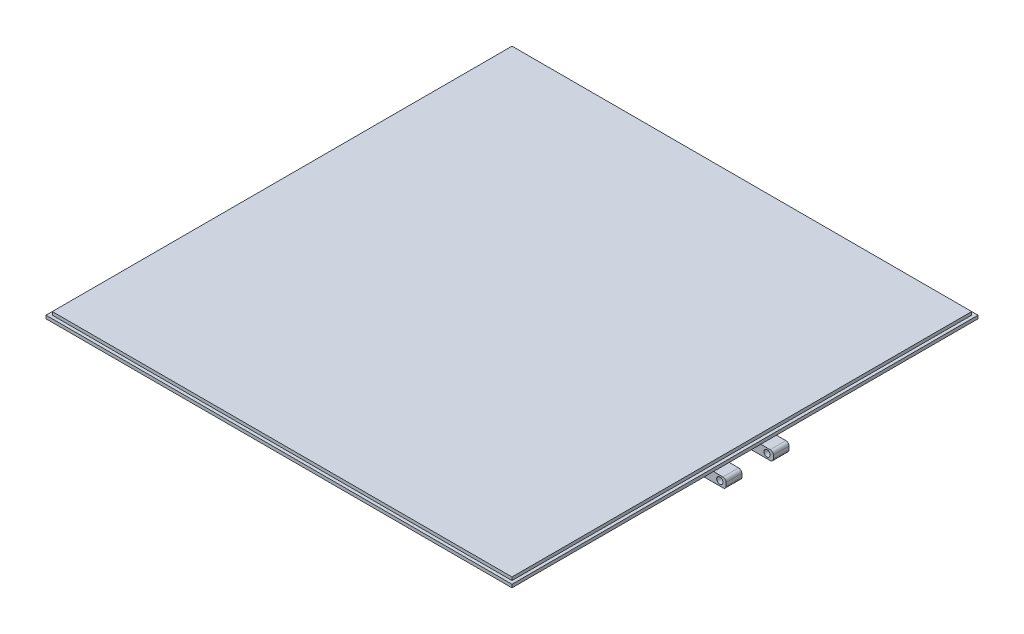
ISO-10303-21;
HEADER;
FILE_DESCRIPTION(('STEP AP214'),'2;1');
FILE_NAME('part.step','',(''),(''),'','','');
FILE_SCHEMA(('AUTOMOTIVE_DESIGN { 1 0 10303 214 1 1 1 1 }'));
ENDSEC;
DATA;
#1=APPLICATION_CONTEXT('core data for automotive mechanical design processes');
#2=APPLICATION_PROTOCOL_DEFINITION('international standard','automotive_design',2000,#1);
#3=PRODUCT_CONTEXT('',#1,'mechanical');
#4=PRODUCT('Part','Part','',(#3));
#5=PRODUCT_RELATED_PRODUCT_CATEGORY('part','',(#4));
#6=PRODUCT_DEFINITION_FORMATION('','',#4);
#7=PRODUCT_DEFINITION_CONTEXT('part definition',#1,'design');
#8=PRODUCT_DEFINITION('design','',#6,#7);
#9=PRODUCT_DEFINITION_SHAPE('','',#8);
#10=(LENGTH_UNIT() NAMED_UNIT(*) SI_UNIT(.MILLI.,.METRE.));
#11=(NAMED_UNIT(*) PLANE_ANGLE_UNIT() SI_UNIT($,.RADIAN.));
#12=(NAMED_UNIT(*) SI_UNIT($,.STERADIAN.) SOLID_ANGLE_UNIT());
#13=UNCERTAINTY_MEASURE_WITH_UNIT(LENGTH_MEASURE(1.E-05),#10,'distance_accuracy_value','');
#14=(GEOMETRIC_REPRESENTATION_CONTEXT(3) GLOBAL_UNCERTAINTY_ASSIGNED_CONTEXT((#13)) GLOBAL_UNIT_ASSIGNED_CONTEXT((#10,
#11,#12)) REPRESENTATION_CONTEXT('',''));
#15=CARTESIAN_POINT('',(0.,0.,0.));
#16=DIRECTION('',(0.,0.,1.));
#17=DIRECTION('',(1.,0.,0.));
#18=AXIS2_PLACEMENT_3D('',#15,#16,#17);
#19=CARTESIAN_POINT('',(0.,26.,0.));
#20=DIRECTION('',(0.,-1.,0.));
#21=DIRECTION('',(0.,0.,-1.));
#22=AXIS2_PLACEMENT_3D('',#19,#20,#21);
#23=PLANE('',#22);
#24=DIRECTION('',(0.,0.,-1.));
#25=VECTOR('',#24,1.);
#26=CARTESIAN_POINT('',(-74.,26.,74.));
#27=LINE('',#26,#25);
#28=CARTESIAN_POINT('',(-74.,26.,74.));
#29=VERTEX_POINT('',#28);
#30=CARTESIAN_POINT('',(-74.,26.,-74.));
#31=VERTEX_POINT('',#30);
#32=EDGE_CURVE('E267',#29,#31,#27,.T.);
#33=ORIENTED_EDGE('',*,*,#32,.F.);
#34=DIRECTION('',(-1.,0.,0.));
#35=VECTOR('',#34,1.);
#36=CARTESIAN_POINT('',(-74.,26.,74.));
#37=LINE('',#36,#35);
#38=CARTESIAN_POINT('',(74.,26.,74.));
#39=VERTEX_POINT('',#38);
#40=EDGE_CURVE('E277',#39,#29,#37,.T.);
#41=ORIENTED_EDGE('',*,*,#40,.F.);
#42=DIRECTION('',(0.,0.,1.));
#43=VECTOR('',#42,1.);
#44=CARTESIAN_POINT('',(74.,26.,74.));
#45=LINE('',#44,#43);
#46=CARTESIAN_POINT('',(74.,26.,-74.));
#47=VERTEX_POINT('',#46);
#48=EDGE_CURVE('E274',#47,#39,#45,.T.);
#49=ORIENTED_EDGE('',*,*,#48,.F.);
#50=DIRECTION('',(1.,0.,0.));
#51=VECTOR('',#50,1.);
#52=CARTESIAN_POINT('',(-74.,26.,-74.));
#53=LINE('',#52,#51);
#54=EDGE_CURVE('E270',#31,#47,#53,.T.);
#55=ORIENTED_EDGE('',*,*,#54,.F.);
#56=EDGE_LOOP('',(#33,#41,#49,#55));
#57=FACE_BOUND('',#56,.T.);
#58=DIRECTION('',(-1.,0.,0.));
#59=VECTOR('',#58,1.);
#60=CARTESIAN_POINT('',(73.,26.,73.));
#61=LINE('',#60,#59);
#62=CARTESIAN_POINT('',(73.,26.,73.));
#63=VERTEX_POINT('',#62);
#64=CARTESIAN_POINT('',(-73.,26.,73.));
#65=VERTEX_POINT('',#64);
#66=EDGE_CURVE('E306',#63,#65,#61,.T.);
#67=ORIENTED_EDGE('',*,*,#66,.T.);
#68=DIRECTION('',(0.,0.,-1.));
#69=VECTOR('',#68,1.);
#70=CARTESIAN_POINT('',(-73.,26.,73.));
#71=LINE('',#70,#69);
#72=CARTESIAN_POINT('',(-73.,26.,-73.));
#73=VERTEX_POINT('',#72);
#74=EDGE_CURVE('E309',#65,#73,#71,.T.);
#75=ORIENTED_EDGE('',*,*,#74,.T.);
#76=DIRECTION('',(1.,0.,0.));
#77=VECTOR('',#76,1.);
#78=CARTESIAN_POINT('',(73.,26.,-73.));
#79=LINE('',#78,#77);
#80=CARTESIAN_POINT('',(73.,26.,-73.));
#81=VERTEX_POINT('',#80);
#82=EDGE_CURVE('E332',#73,#81,#79,.T.);
#83=ORIENTED_EDGE('',*,*,#82,.T.);
#84=DIRECTION('',(0.,0.,1.));
#85=VECTOR('',#84,1.);
#86=CARTESIAN_POINT('',(73.,26.,73.));
#87=LINE('',#86,#85);
#88=EDGE_CURVE('E297',#81,#63,#87,.T.);
#89=ORIENTED_EDGE('',*,*,#88,.T.);
#90=EDGE_LOOP('',(#67,#75,#83,#89));
#91=FACE_BOUND('',#90,.T.);
#92=ADVANCED_FACE('F55',(#57,#91),#23,.F.);
#93=CARTESIAN_POINT('',(-74.,26.,74.));
#94=DIRECTION('',(-1.,0.,0.));
#95=DIRECTION('',(0.,0.,1.));
#96=AXIS2_PLACEMENT_3D('',#93,#94,#95);
#97=PLANE('',#96);
#98=DIRECTION('',(0.,0.,-1.));
#99=VECTOR('',#98,1.);
#100=CARTESIAN_POINT('',(-74.,25.,74.));
#101=LINE('',#100,#99);
#102=CARTESIAN_POINT('',(-74.,25.,74.));
#103=VERTEX_POINT('',#102);
#104=CARTESIAN_POINT('',(-74.,25.,-74.));
#105=VERTEX_POINT('',#104);
#106=EDGE_CURVE('E266',#103,#105,#101,.T.);
#107=ORIENTED_EDGE('',*,*,#106,.F.);
#108=DIRECTION('',(0.,-1.,0.));
#109=VECTOR('',#108,1.);
#110=CARTESIAN_POINT('',(-74.,26.,74.));
#111=LINE('',#110,#109);
#112=EDGE_CURVE('E295',#29,#103,#111,.T.);
#113=ORIENTED_EDGE('',*,*,#112,.F.);
#114=ORIENTED_EDGE('',*,*,#32,.T.);
#115=DIRECTION('',(0.,-1.,0.));
#116=VECTOR('',#115,1.);
#117=CARTESIAN_POINT('',(-74.,26.,-74.));
#118=LINE('',#117,#116);
#119=EDGE_CURVE('E280',#31,#105,#118,.T.);
#120=ORIENTED_EDGE('',*,*,#119,.T.);
#121=EDGE_LOOP('',(#107,#113,#114,#120));
#122=FACE_BOUND('',#121,.T.);
#123=ADVANCED_FACE('F452',(#122),#97,.T.);
#124=CARTESIAN_POINT('',(-74.,26.,74.));
#125=DIRECTION('',(0.,0.,1.));
#126=DIRECTION('',(1.,0.,0.));
#127=AXIS2_PLACEMENT_3D('',#124,#125,#126);
#128=PLANE('',#127);
#129=DIRECTION('',(-1.,0.,0.));
#130=VECTOR('',#129,1.);
#131=CARTESIAN_POINT('',(-74.,25.,74.));
#132=LINE('',#131,#130);
#133=CARTESIAN_POINT('',(74.,25.,74.));
#134=VERTEX_POINT('',#133);
#135=EDGE_CURVE('E271',#134,#103,#132,.T.);
#136=ORIENTED_EDGE('',*,*,#135,.F.);
#137=DIRECTION('',(0.,-1.,0.));
#138=VECTOR('',#137,1.);
#139=CARTESIAN_POINT('',(74.,26.,74.));
#140=LINE('',#139,#138);
#141=EDGE_CURVE('E298',#39,#134,#140,.T.);
#142=ORIENTED_EDGE('',*,*,#141,.F.);
#143=ORIENTED_EDGE('',*,*,#40,.T.);
#144=ORIENTED_EDGE('',*,*,#112,.T.);
#145=EDGE_LOOP('',(#136,#142,#143,#144));
#146=FACE_BOUND('',#145,.T.);
#147=ADVANCED_FACE('F458',(#146),#128,.T.);
#148=CARTESIAN_POINT('',(74.,26.,74.));
#149=DIRECTION('',(1.,0.,0.));
#150=DIRECTION('',(0.,0.,-1.));
#151=AXIS2_PLACEMENT_3D('',#148,#149,#150);
#152=PLANE('',#151);
#153=DIRECTION('',(0.,0.,1.));
#154=VECTOR('',#153,1.);
#155=CARTESIAN_POINT('',(74.,25.,74.));
#156=LINE('',#155,#154);
#157=CARTESIAN_POINT('',(74.,25.,-74.));
#158=VERTEX_POINT('',#157);
#159=CARTESIAN_POINT('',(74.,25.,-9.99999999999999));
#160=VERTEX_POINT('',#159);
#161=EDGE_CURVE('E287',#158,#160,#156,.T.);
#162=ORIENTED_EDGE('',*,*,#161,.F.);
#163=DIRECTION('',(0.,-1.,0.));
#164=VECTOR('',#163,1.);
#165=CARTESIAN_POINT('',(74.,26.,-74.));
#166=LINE('',#165,#164);
#167=EDGE_CURVE('E301',#47,#158,#166,.T.);
#168=ORIENTED_EDGE('',*,*,#167,.F.);
#169=ORIENTED_EDGE('',*,*,#48,.T.);
#170=ORIENTED_EDGE('',*,*,#141,.T.);
#171=CARTESIAN_POINT('',(74.,25.,10.));
#172=VERTEX_POINT('',#171);
#173=EDGE_CURVE('E286',#172,#134,#156,.T.);
#174=ORIENTED_EDGE('',*,*,#173,.F.);
#175=CARTESIAN_POINT('',(74.,25.,5.));
#176=VERTEX_POINT('',#175);
#177=EDGE_CURVE('E292',#176,#172,#156,.T.);
#178=ORIENTED_EDGE('',*,*,#177,.F.);
#179=CARTESIAN_POINT('',(74.,25.,-5.));
#180=VERTEX_POINT('',#179);
#181=EDGE_CURVE('E291',#180,#176,#156,.T.);
#182=ORIENTED_EDGE('',*,*,#181,.F.);
#183=EDGE_CURVE('E290',#160,#180,#156,.T.);
#184=ORIENTED_EDGE('',*,*,#183,.F.);
#185=EDGE_LOOP('',(#162,#168,#169,#170,#174,#178,#182,#184));
#186=FACE_BOUND('',#185,.T.);
#187=ADVANCED_FACE('F407',(#186),#152,.T.);
#188=CARTESIAN_POINT('',(-74.,26.,-74.));
#189=DIRECTION('',(0.,0.,-1.));
#190=DIRECTION('',(-1.,0.,0.));
#191=AXIS2_PLACEMENT_3D('',#188,#189,#190);
#192=PLANE('',#191);
#193=DIRECTION('',(1.,0.,0.));
#194=VECTOR('',#193,1.);
#195=CARTESIAN_POINT('',(-74.,25.,-74.));
#196=LINE('',#195,#194);
#197=EDGE_CURVE('E283',#105,#158,#196,.T.);
#198=ORIENTED_EDGE('',*,*,#197,.F.);
#199=ORIENTED_EDGE('',*,*,#119,.F.);
#200=ORIENTED_EDGE('',*,*,#54,.T.);
#201=ORIENTED_EDGE('',*,*,#167,.T.);
#202=EDGE_LOOP('',(#198,#199,#200,#201));
#203=FACE_BOUND('',#202,.T.);
#204=ADVANCED_FACE('F471',(#203),#192,.T.);
#205=CARTESIAN_POINT('',(0.,27.,0.));
#206=DIRECTION('',(0.,1.,0.));
#207=DIRECTION('',(0.,0.,1.));
#208=AXIS2_PLACEMENT_3D('',#205,#206,#207);
#209=PLANE('',#208);
#210=DIRECTION('',(0.,0.,1.));
#211=VECTOR('',#210,1.);
#212=CARTESIAN_POINT('',(-73.,27.,73.));
#213=LINE('',#212,#211);
#214=CARTESIAN_POINT('',(-73.,27.,-73.));
#215=VERTEX_POINT('',#214);
#216=CARTESIAN_POINT('',(-73.,27.,73.));
#217=VERTEX_POINT('',#216);
#218=EDGE_CURVE('E312',#215,#217,#213,.T.);
#219=ORIENTED_EDGE('',*,*,#218,.T.);
#220=DIRECTION('',(1.,0.,0.));
#221=VECTOR('',#220,1.);
#222=CARTESIAN_POINT('',(73.,27.,73.));
#223=LINE('',#222,#221);
#224=CARTESIAN_POINT('',(73.,27.,73.));
#225=VERTEX_POINT('',#224);
#226=EDGE_CURVE('E315',#217,#225,#223,.T.);
#227=ORIENTED_EDGE('',*,*,#226,.T.);
#228=DIRECTION('',(0.,0.,-1.));
#229=VECTOR('',#228,1.);
#230=CARTESIAN_POINT('',(73.,27.,73.));
#231=LINE('',#230,#229);
#232=CARTESIAN_POINT('',(73.,27.,-73.));
#233=VERTEX_POINT('',#232);
#234=EDGE_CURVE('E317',#225,#233,#231,.T.);
#235=ORIENTED_EDGE('',*,*,#234,.T.);
#236=DIRECTION('',(-1.,0.,0.));
#237=VECTOR('',#236,1.);
#238=CARTESIAN_POINT('',(73.,27.,-73.));
#239=LINE('',#238,#237);
#240=EDGE_CURVE('E319',#233,#215,#239,.T.);
#241=ORIENTED_EDGE('',*,*,#240,.T.);
#242=EDGE_LOOP('',(#219,#227,#235,#241));
#243=FACE_BOUND('',#242,.T.);
#244=ADVANCED_FACE('F473',(#243),#209,.T.);
#245=CARTESIAN_POINT('',(73.,27.,-73.));
#246=DIRECTION('',(0.,0.,1.));
#247=DIRECTION('',(1.,0.,0.));
#248=AXIS2_PLACEMENT_3D('',#245,#246,#247);
#249=PLANE('',#248);
#250=ORIENTED_EDGE('',*,*,#82,.F.);
#251=DIRECTION('',(0.,-1.,0.));
#252=VECTOR('',#251,1.);
#253=CARTESIAN_POINT('',(-73.,27.,-73.));
#254=LINE('',#253,#252);
#255=EDGE_CURVE('E321',#215,#73,#254,.T.);
#256=ORIENTED_EDGE('',*,*,#255,.F.);
#257=ORIENTED_EDGE('',*,*,#240,.F.);
#258=DIRECTION('',(0.,-1.,0.));
#259=VECTOR('',#258,1.);
#260=CARTESIAN_POINT('',(73.,27.,-73.));
#261=LINE('',#260,#259);
#262=EDGE_CURVE('E324',#233,#81,#261,.T.);
#263=ORIENTED_EDGE('',*,*,#262,.T.);
#264=EDGE_LOOP('',(#250,#256,#257,#263));
#265=FACE_BOUND('',#264,.T.);
#266=ADVANCED_FACE('F478',(#265),#249,.F.);
#267=CARTESIAN_POINT('',(73.,27.,73.));
#268=DIRECTION('',(-1.,0.,0.));
#269=DIRECTION('',(0.,0.,1.));
#270=AXIS2_PLACEMENT_3D('',#267,#268,#269);
#271=PLANE('',#270);
#272=ORIENTED_EDGE('',*,*,#88,.F.);
#273=ORIENTED_EDGE('',*,*,#262,.F.);
#274=ORIENTED_EDGE('',*,*,#234,.F.);
#275=DIRECTION('',(0.,-1.,0.));
#276=VECTOR('',#275,1.);
#277=CARTESIAN_POINT('',(73.,27.,73.));
#278=LINE('',#277,#276);
#279=EDGE_CURVE('E326',#225,#63,#278,.T.);
#280=ORIENTED_EDGE('',*,*,#279,.T.);
#281=EDGE_LOOP('',(#272,#273,#274,#280));
#282=FACE_BOUND('',#281,.T.);
#283=ADVANCED_FACE('F484',(#282),#271,.F.);
#284=CARTESIAN_POINT('',(73.,27.,73.));
#285=DIRECTION('',(0.,0.,-1.));
#286=DIRECTION('',(-1.,0.,0.));
#287=AXIS2_PLACEMENT_3D('',#284,#285,#286);
#288=PLANE('',#287);
#289=ORIENTED_EDGE('',*,*,#66,.F.);
#290=ORIENTED_EDGE('',*,*,#279,.F.);
#291=ORIENTED_EDGE('',*,*,#226,.F.);
#292=DIRECTION('',(0.,-1.,0.));
#293=VECTOR('',#292,1.);
#294=CARTESIAN_POINT('',(-73.,27.,73.));
#295=LINE('',#294,#293);
#296=EDGE_CURVE('E329',#217,#65,#295,.T.);
#297=ORIENTED_EDGE('',*,*,#296,.T.);
#298=EDGE_LOOP('',(#289,#290,#291,#297));
#299=FACE_BOUND('',#298,.T.);
#300=ADVANCED_FACE('F488',(#299),#288,.F.);
#301=CARTESIAN_POINT('',(-73.,27.,73.));
#302=DIRECTION('',(1.,0.,0.));
#303=DIRECTION('',(0.,0.,-1.));
#304=AXIS2_PLACEMENT_3D('',#301,#302,#303);
#305=PLANE('',#304);
#306=ORIENTED_EDGE('',*,*,#74,.F.);
#307=ORIENTED_EDGE('',*,*,#296,.F.);
#308=ORIENTED_EDGE('',*,*,#218,.F.);
#309=ORIENTED_EDGE('',*,*,#255,.T.);
#310=EDGE_LOOP('',(#306,#307,#308,#309));
#311=FACE_BOUND('',#310,.T.);
#312=ADVANCED_FACE('F492',(#311),#305,.F.);
#313=CARTESIAN_POINT('',(0.,0.,10.));
#314=DIRECTION('',(0.,0.,1.));
#315=DIRECTION('',(1.,0.,0.));
#316=AXIS2_PLACEMENT_3D('',#313,#314,#315);
#317=PLANE('',#316);
#318=DIRECTION('',(1.,0.,0.));
#319=VECTOR('',#318,1.);
#320=CARTESIAN_POINT('',(68.,22.,10.));
#321=LINE('',#320,#319);
#322=CARTESIAN_POINT('',(68.,22.,10.));
#323=VERTEX_POINT('',#322);
#324=CARTESIAN_POINT('',(77.,22.,10.));
#325=VERTEX_POINT('',#324);
#326=EDGE_CURVE('E249',#323,#325,#321,.T.);
#327=ORIENTED_EDGE('',*,*,#326,.T.);
#328=CARTESIAN_POINT('',(77.,23.,10.));
#329=DIRECTION('',(0.,0.,1.));
#330=DIRECTION('',(1.,0.,0.));
#331=AXIS2_PLACEMENT_3D('',#328,#329,#330);
#332=CIRCLE('',#331,1.);
#333=CARTESIAN_POINT('',(78.,23.,10.));
#334=VERTEX_POINT('',#333);
#335=EDGE_CURVE('E63',#325,#334,#332,.T.);
#336=ORIENTED_EDGE('',*,*,#335,.T.);
#337=DIRECTION('',(0.,1.,0.));
#338=VECTOR('',#337,1.);
#339=CARTESIAN_POINT('',(78.,25.,10.));
#340=LINE('',#339,#338);
#341=CARTESIAN_POINT('',(78.,24.,10.));
#342=VERTEX_POINT('',#341);
#343=EDGE_CURVE('E251',#334,#342,#340,.T.);
#344=ORIENTED_EDGE('',*,*,#343,.T.);
#345=CARTESIAN_POINT('',(77.,24.,10.));
#346=DIRECTION('',(0.,0.,1.));
#347=DIRECTION('',(1.,0.,0.));
#348=AXIS2_PLACEMENT_3D('',#345,#346,#347);
#349=CIRCLE('',#348,1.);
#350=CARTESIAN_POINT('',(77.,25.,10.));
#351=VERTEX_POINT('',#350);
#352=EDGE_CURVE('E70',#342,#351,#349,.T.);
#353=ORIENTED_EDGE('',*,*,#352,.T.);
#354=DIRECTION('',(-1.,0.,0.));
#355=VECTOR('',#354,1.);
#356=CARTESIAN_POINT('',(68.,25.,10.));
#357=LINE('',#356,#355);
#358=EDGE_CURVE('E255',#351,#172,#357,.T.);
#359=ORIENTED_EDGE('',*,*,#358,.T.);
#360=CARTESIAN_POINT('',(65.,25.,10.));
#361=VERTEX_POINT('',#360);
#362=EDGE_CURVE('E254',#172,#361,#357,.T.);
#363=ORIENTED_EDGE('',*,*,#362,.T.);
#364=DIRECTION('',(-0.707106781186544,0.707106781186551,0.));
#365=VECTOR('',#364,1.);
#366=CARTESIAN_POINT('',(68.,22.,10.));
#367=LINE('',#366,#365);
#368=EDGE_CURVE('E343',#361,#323,#367,.F.);
#369=ORIENTED_EDGE('',*,*,#368,.T.);
#370=EDGE_LOOP('',(#327,#336,#344,#353,#359,#363,#369));
#371=FACE_BOUND('',#370,.T.);
#372=CARTESIAN_POINT('',(76.,23.5,10.));
#373=DIRECTION('',(0.,0.,1.));
#374=DIRECTION('',(1.,0.,0.));
#375=AXIS2_PLACEMENT_3D('',#372,#373,#374);
#376=CIRCLE('',#375,0.999999999999998);
#377=CARTESIAN_POINT('',(77.,23.5,10.));
#378=VERTEX_POINT('',#377);
#379=EDGE_CURVE('E240',#378,#378,#376,.T.);
#380=ORIENTED_EDGE('',*,*,#379,.F.);
#381=EDGE_LOOP('',(#380));
#382=FACE_BOUND('',#381,.T.);
#383=ADVANCED_FACE('F374',(#371,#382),#317,.T.);
#384=CARTESIAN_POINT('',(0.,0.,5.));
#385=DIRECTION('',(0.,0.,1.));
#386=DIRECTION('',(1.,0.,0.));
#387=AXIS2_PLACEMENT_3D('',#384,#385,#386);
#388=PLANE('',#387);
#389=DIRECTION('',(0.,1.,0.));
#390=VECTOR('',#389,1.);
#391=CARTESIAN_POINT('',(78.,25.,5.));
#392=LINE('',#391,#390);
#393=CARTESIAN_POINT('',(78.,23.,5.));
#394=VERTEX_POINT('',#393);
#395=CARTESIAN_POINT('',(78.,24.,5.));
#396=VERTEX_POINT('',#395);
#397=EDGE_CURVE('E259',#394,#396,#392,.T.);
#398=ORIENTED_EDGE('',*,*,#397,.F.);
#399=CARTESIAN_POINT('',(77.,23.,5.));
#400=DIRECTION('',(0.,0.,1.));
#401=DIRECTION('',(1.,0.,0.));
#402=AXIS2_PLACEMENT_3D('',#399,#400,#401);
#403=CIRCLE('',#402,1.);
#404=CARTESIAN_POINT('',(77.,22.,5.));
#405=VERTEX_POINT('',#404);
#406=EDGE_CURVE('E369',#394,#405,#403,.F.);
#407=ORIENTED_EDGE('',*,*,#406,.T.);
#408=DIRECTION('',(1.,0.,0.));
#409=VECTOR('',#408,1.);
#410=CARTESIAN_POINT('',(68.,22.,5.));
#411=LINE('',#410,#409);
#412=CARTESIAN_POINT('',(68.,22.,5.));
#413=VERTEX_POINT('',#412);
#414=EDGE_CURVE('E247',#413,#405,#411,.T.);
#415=ORIENTED_EDGE('',*,*,#414,.F.);
#416=DIRECTION('',(0.707106781186544,-0.707106781186551,0.));
#417=VECTOR('',#416,1.);
#418=CARTESIAN_POINT('',(45.0000000000003,44.9999999999999,5.));
#419=LINE('',#418,#417);
#420=CARTESIAN_POINT('',(65.,25.,5.));
#421=VERTEX_POINT('',#420);
#422=EDGE_CURVE('E220',#413,#421,#419,.F.);
#423=ORIENTED_EDGE('',*,*,#422,.T.);
#424=DIRECTION('',(-1.,0.,0.));
#425=VECTOR('',#424,1.);
#426=CARTESIAN_POINT('',(68.,25.,5.));
#427=LINE('',#426,#425);
#428=EDGE_CURVE('E262',#176,#421,#427,.T.);
#429=ORIENTED_EDGE('',*,*,#428,.F.);
#430=CARTESIAN_POINT('',(77.,25.,5.));
#431=VERTEX_POINT('',#430);
#432=EDGE_CURVE('E252',#431,#176,#427,.T.);
#433=ORIENTED_EDGE('',*,*,#432,.F.);
#434=CARTESIAN_POINT('',(77.,24.,5.));
#435=DIRECTION('',(0.,0.,1.));
#436=DIRECTION('',(1.,0.,0.));
#437=AXIS2_PLACEMENT_3D('',#434,#435,#436);
#438=CIRCLE('',#437,1.);
#439=EDGE_CURVE('E367',#431,#396,#438,.F.);
#440=ORIENTED_EDGE('',*,*,#439,.T.);
#441=EDGE_LOOP('',(#398,#407,#415,#423,#429,#433,#440));
#442=FACE_BOUND('',#441,.T.);
#443=CARTESIAN_POINT('',(76.,23.5,5.));
#444=DIRECTION('',(0.,0.,1.));
#445=DIRECTION('',(1.,0.,0.));
#446=AXIS2_PLACEMENT_3D('',#443,#444,#445);
#447=CIRCLE('',#446,0.999999999999998);
#448=CARTESIAN_POINT('',(77.,23.5,5.));
#449=VERTEX_POINT('',#448);
#450=EDGE_CURVE('E236',#449,#449,#447,.T.);
#451=ORIENTED_EDGE('',*,*,#450,.T.);
#452=EDGE_LOOP('',(#451));
#453=FACE_BOUND('',#452,.T.);
#454=ADVANCED_FACE('F385',(#442,#453),#388,.F.);
#455=CARTESIAN_POINT('',(68.,22.,10.));
#456=DIRECTION('',(0.,1.,0.));
#457=DIRECTION('',(-1.,0.,0.));
#458=AXIS2_PLACEMENT_3D('',#455,#456,#457);
#459=PLANE('',#458);
#460=ORIENTED_EDGE('',*,*,#414,.T.);
#461=DIRECTION('',(0.,0.,-1.));
#462=VECTOR('',#461,1.);
#463=CARTESIAN_POINT('',(77.,22.,10.));
#464=LINE('',#463,#462);
#465=EDGE_CURVE('E78',#405,#325,#464,.F.);
#466=ORIENTED_EDGE('',*,*,#465,.T.);
#467=ORIENTED_EDGE('',*,*,#326,.F.);
#468=DIRECTION('',(0.,0.,-1.));
#469=VECTOR('',#468,1.);
#470=CARTESIAN_POINT('',(68.,22.,10.));
#471=LINE('',#470,#469);
#472=EDGE_CURVE('E257',#323,#413,#471,.T.);
#473=ORIENTED_EDGE('',*,*,#472,.T.);
#474=EDGE_LOOP('',(#460,#466,#467,#473));
#475=FACE_BOUND('',#474,.T.);
#476=ADVANCED_FACE('F387',(#475),#459,.F.);
#477=CARTESIAN_POINT('',(78.,25.,10.));
#478=DIRECTION('',(-1.,0.,0.));
#479=DIRECTION('',(0.,-1.,0.));
#480=AXIS2_PLACEMENT_3D('',#477,#478,#479);
#481=PLANE('',#480);
#482=ORIENTED_EDGE('',*,*,#343,.F.);
#483=DIRECTION('',(0.,0.,-1.));
#484=VECTOR('',#483,1.);
#485=CARTESIAN_POINT('',(78.,23.,10.));
#486=LINE('',#485,#484);
#487=EDGE_CURVE('E364',#334,#394,#486,.T.);
#488=ORIENTED_EDGE('',*,*,#487,.T.);
#489=ORIENTED_EDGE('',*,*,#397,.T.);
#490=DIRECTION('',(0.,0.,-1.));
#491=VECTOR('',#490,1.);
#492=CARTESIAN_POINT('',(78.,24.,10.));
#493=LINE('',#492,#491);
#494=EDGE_CURVE('E362',#396,#342,#493,.F.);
#495=ORIENTED_EDGE('',*,*,#494,.T.);
#496=EDGE_LOOP('',(#482,#488,#489,#495));
#497=FACE_BOUND('',#496,.T.);
#498=ADVANCED_FACE('F379',(#497),#481,.F.);
#499=CARTESIAN_POINT('',(68.,25.,10.));
#500=DIRECTION('',(0.,-1.,0.));
#501=DIRECTION('',(0.,0.,-1.));
#502=AXIS2_PLACEMENT_3D('',#499,#500,#501);
#503=PLANE('',#502);
#504=ORIENTED_EDGE('',*,*,#358,.F.);
#505=DIRECTION('',(0.,0.,-1.));
#506=VECTOR('',#505,1.);
#507=CARTESIAN_POINT('',(77.,25.,10.));
#508=LINE('',#507,#506);
#509=EDGE_CURVE('E12',#351,#431,#508,.T.);
#510=ORIENTED_EDGE('',*,*,#509,.T.);
#511=ORIENTED_EDGE('',*,*,#432,.T.);
#512=ORIENTED_EDGE('',*,*,#177,.T.);
#513=EDGE_LOOP('',(#504,#510,#511,#512));
#514=FACE_BOUND('',#513,.T.);
#515=ADVANCED_FACE('F447',(#514),#503,.F.);
#516=CARTESIAN_POINT('',(76.,23.5,10.));
#517=DIRECTION('',(0.,0.,-1.));
#518=DIRECTION('',(-1.,0.,0.));
#519=AXIS2_PLACEMENT_3D('',#516,#517,#518);
#520=CYLINDRICAL_SURFACE('',#519,0.999999999999998);
#521=ORIENTED_EDGE('',*,*,#379,.T.);
#522=EDGE_LOOP('',(#521));
#523=FACE_BOUND('',#522,.T.);
#524=ORIENTED_EDGE('',*,*,#450,.F.);
#525=EDGE_LOOP('',(#524));
#526=FACE_BOUND('',#525,.T.);
#527=ADVANCED_FACE('F439',(#523,#526),#520,.F.);
#528=CARTESIAN_POINT('',(0.,0.,-5.));
#529=DIRECTION('',(0.,0.,1.));
#530=DIRECTION('',(1.,0.,0.));
#531=AXIS2_PLACEMENT_3D('',#528,#529,#530);
#532=PLANE('',#531);
#533=DIRECTION('',(0.,1.,0.));
#534=VECTOR('',#533,1.);
#535=CARTESIAN_POINT('',(78.,25.,-5.));
#536=LINE('',#535,#534);
#537=CARTESIAN_POINT('',(78.,23.,-5.));
#538=VERTEX_POINT('',#537);
#539=CARTESIAN_POINT('',(78.,24.,-5.));
#540=VERTEX_POINT('',#539);
#541=EDGE_CURVE('E230',#538,#540,#536,.T.);
#542=ORIENTED_EDGE('',*,*,#541,.T.);
#543=CARTESIAN_POINT('',(77.,24.,-5.));
#544=DIRECTION('',(0.,0.,1.));
#545=DIRECTION('',(1.,0.,0.));
#546=AXIS2_PLACEMENT_3D('',#543,#544,#545);
#547=CIRCLE('',#546,1.);
#548=CARTESIAN_POINT('',(77.,25.,-5.));
#549=VERTEX_POINT('',#548);
#550=EDGE_CURVE('E359',#540,#549,#547,.T.);
#551=ORIENTED_EDGE('',*,*,#550,.T.);
#552=DIRECTION('',(-1.,0.,0.));
#553=VECTOR('',#552,1.);
#554=CARTESIAN_POINT('',(68.,25.,-5.));
#555=LINE('',#554,#553);
#556=EDGE_CURVE('E237',#549,#180,#555,.T.);
#557=ORIENTED_EDGE('',*,*,#556,.T.);
#558=CARTESIAN_POINT('',(65.,25.,-5.));
#559=VERTEX_POINT('',#558);
#560=EDGE_CURVE('E215',#180,#559,#555,.T.);
#561=ORIENTED_EDGE('',*,*,#560,.T.);
#562=DIRECTION('',(-0.707106781186544,0.707106781186551,0.));
#563=VECTOR('',#562,1.);
#564=CARTESIAN_POINT('',(68.,22.,-5.));
#565=LINE('',#564,#563);
#566=CARTESIAN_POINT('',(68.,22.,-5.));
#567=VERTEX_POINT('',#566);
#568=EDGE_CURVE('E207',#559,#567,#565,.F.);
#569=ORIENTED_EDGE('',*,*,#568,.T.);
#570=DIRECTION('',(1.,0.,0.));
#571=VECTOR('',#570,1.);
#572=CARTESIAN_POINT('',(68.,22.,-5.));
#573=LINE('',#572,#571);
#574=CARTESIAN_POINT('',(77.,22.,-5.));
#575=VERTEX_POINT('',#574);
#576=EDGE_CURVE('E212',#567,#575,#573,.T.);
#577=ORIENTED_EDGE('',*,*,#576,.T.);
#578=CARTESIAN_POINT('',(77.,23.,-5.));
#579=DIRECTION('',(0.,0.,1.));
#580=DIRECTION('',(1.,0.,0.));
#581=AXIS2_PLACEMENT_3D('',#578,#579,#580);
#582=CIRCLE('',#581,1.);
#583=EDGE_CURVE('E357',#575,#538,#582,.T.);
#584=ORIENTED_EDGE('',*,*,#583,.T.);
#585=EDGE_LOOP('',(#542,#551,#557,#561,#569,#577,#584));
#586=FACE_BOUND('',#585,.T.);
#587=CARTESIAN_POINT('',(76.,23.5,-5.));
#588=DIRECTION('',(0.,0.,1.));
#589=DIRECTION('',(1.,0.,0.));
#590=AXIS2_PLACEMENT_3D('',#587,#588,#589);
#591=CIRCLE('',#590,0.999999999999998);
#592=CARTESIAN_POINT('',(77.,23.5,-5.));
#593=VERTEX_POINT('',#592);
#594=EDGE_CURVE('E426',#593,#593,#591,.T.);
#595=ORIENTED_EDGE('',*,*,#594,.F.);
#596=EDGE_LOOP('',(#595));
#597=FACE_BOUND('',#596,.T.);
#598=ADVANCED_FACE('F210',(#586,#597),#532,.T.);
#599=CARTESIAN_POINT('',(0.,0.,-10.));
#600=DIRECTION('',(0.,0.,1.));
#601=DIRECTION('',(1.,0.,0.));
#602=AXIS2_PLACEMENT_3D('',#599,#600,#601);
#603=PLANE('',#602);
#604=DIRECTION('',(-1.,0.,0.));
#605=VECTOR('',#604,1.);
#606=CARTESIAN_POINT('',(68.,25.,-10.));
#607=LINE('',#606,#605);
#608=CARTESIAN_POINT('',(77.,25.,-10.));
#609=VERTEX_POINT('',#608);
#610=EDGE_CURVE('E231',#609,#160,#607,.T.);
#611=ORIENTED_EDGE('',*,*,#610,.F.);
#612=CARTESIAN_POINT('',(77.,24.,-10.));
#613=DIRECTION('',(0.,0.,1.));
#614=DIRECTION('',(1.,0.,0.));
#615=AXIS2_PLACEMENT_3D('',#612,#613,#614);
#616=CIRCLE('',#615,1.);
#617=CARTESIAN_POINT('',(78.,24.,-10.));
#618=VERTEX_POINT('',#617);
#619=EDGE_CURVE('E350',#609,#618,#616,.F.);
#620=ORIENTED_EDGE('',*,*,#619,.T.);
#621=DIRECTION('',(0.,1.,0.));
#622=VECTOR('',#621,1.);
#623=CARTESIAN_POINT('',(78.,25.,-10.));
#624=LINE('',#623,#622);
#625=CARTESIAN_POINT('',(78.,23.,-10.));
#626=VERTEX_POINT('',#625);
#627=EDGE_CURVE('E420',#626,#618,#624,.T.);
#628=ORIENTED_EDGE('',*,*,#627,.F.);
#629=CARTESIAN_POINT('',(77.,23.,-10.));
#630=DIRECTION('',(0.,0.,1.));
#631=DIRECTION('',(1.,0.,0.));
#632=AXIS2_PLACEMENT_3D('',#629,#630,#631);
#633=CIRCLE('',#632,1.);
#634=CARTESIAN_POINT('',(77.,22.,-10.));
#635=VERTEX_POINT('',#634);
#636=EDGE_CURVE('E348',#626,#635,#633,.F.);
#637=ORIENTED_EDGE('',*,*,#636,.T.);
#638=DIRECTION('',(1.,0.,0.));
#639=VECTOR('',#638,1.);
#640=CARTESIAN_POINT('',(68.,22.,-10.));
#641=LINE('',#640,#639);
#642=CARTESIAN_POINT('',(68.,22.,-10.));
#643=VERTEX_POINT('',#642);
#644=EDGE_CURVE('E422',#643,#635,#641,.T.);
#645=ORIENTED_EDGE('',*,*,#644,.F.);
#646=DIRECTION('',(0.707106781186544,-0.707106781186551,0.));
#647=VECTOR('',#646,1.);
#648=CARTESIAN_POINT('',(45.0000000000003,44.9999999999999,-10.));
#649=LINE('',#648,#647);
#650=CARTESIAN_POINT('',(65.,25.,-10.));
#651=VERTEX_POINT('',#650);
#652=EDGE_CURVE('E221',#643,#651,#649,.F.);
#653=ORIENTED_EDGE('',*,*,#652,.T.);
#654=EDGE_CURVE('E415',#160,#651,#607,.T.);
#655=ORIENTED_EDGE('',*,*,#654,.F.);
#656=EDGE_LOOP('',(#611,#620,#628,#637,#645,#653,#655));
#657=FACE_BOUND('',#656,.T.);
#658=CARTESIAN_POINT('',(76.,23.5,-10.));
#659=DIRECTION('',(0.,0.,1.));
#660=DIRECTION('',(1.,0.,0.));
#661=AXIS2_PLACEMENT_3D('',#658,#659,#660);
#662=CIRCLE('',#661,0.999999999999998);
#663=CARTESIAN_POINT('',(77.,23.5,-10.));
#664=VERTEX_POINT('',#663);
#665=EDGE_CURVE('E430',#664,#664,#662,.T.);
#666=ORIENTED_EDGE('',*,*,#665,.T.);
#667=EDGE_LOOP('',(#666));
#668=FACE_BOUND('',#667,.T.);
#669=ADVANCED_FACE('F418',(#657,#668),#603,.F.);
#670=CARTESIAN_POINT('',(68.,22.,-5.));
#671=DIRECTION('',(0.,1.,0.));
#672=DIRECTION('',(-1.,0.,0.));
#673=AXIS2_PLACEMENT_3D('',#670,#671,#672);
#674=PLANE('',#673);
#675=ORIENTED_EDGE('',*,*,#644,.T.);
#676=DIRECTION('',(0.,0.,-1.));
#677=VECTOR('',#676,1.);
#678=CARTESIAN_POINT('',(77.,22.,-5.));
#679=LINE('',#678,#677);
#680=EDGE_CURVE('E229',#635,#575,#679,.F.);
#681=ORIENTED_EDGE('',*,*,#680,.T.);
#682=ORIENTED_EDGE('',*,*,#576,.F.);
#683=DIRECTION('',(0.,0.,-1.));
#684=VECTOR('',#683,1.);
#685=CARTESIAN_POINT('',(68.,22.,-5.));
#686=LINE('',#685,#684);
#687=EDGE_CURVE('E227',#567,#643,#686,.T.);
#688=ORIENTED_EDGE('',*,*,#687,.T.);
#689=EDGE_LOOP('',(#675,#681,#682,#688));
#690=FACE_BOUND('',#689,.T.);
#691=ADVANCED_FACE('F226',(#690),#674,.F.);
#692=CARTESIAN_POINT('',(78.,25.,-5.));
#693=DIRECTION('',(-1.,0.,0.));
#694=DIRECTION('',(0.,-1.,0.));
#695=AXIS2_PLACEMENT_3D('',#692,#693,#694);
#696=PLANE('',#695);
#697=ORIENTED_EDGE('',*,*,#627,.T.);
#698=DIRECTION('',(0.,0.,-1.));
#699=VECTOR('',#698,1.);
#700=CARTESIAN_POINT('',(78.,24.,-5.));
#701=LINE('',#700,#699);
#702=EDGE_CURVE('E355',#618,#540,#701,.F.);
#703=ORIENTED_EDGE('',*,*,#702,.T.);
#704=ORIENTED_EDGE('',*,*,#541,.F.);
#705=DIRECTION('',(0.,0.,-1.));
#706=VECTOR('',#705,1.);
#707=CARTESIAN_POINT('',(78.,23.,-5.));
#708=LINE('',#707,#706);
#709=EDGE_CURVE('E352',#538,#626,#708,.T.);
#710=ORIENTED_EDGE('',*,*,#709,.T.);
#711=EDGE_LOOP('',(#697,#703,#704,#710));
#712=FACE_BOUND('',#711,.T.);
#713=ADVANCED_FACE('F533',(#712),#696,.F.);
#714=CARTESIAN_POINT('',(68.,25.,-5.));
#715=DIRECTION('',(0.,-1.,0.));
#716=DIRECTION('',(0.,0.,-1.));
#717=AXIS2_PLACEMENT_3D('',#714,#715,#716);
#718=PLANE('',#717);
#719=ORIENTED_EDGE('',*,*,#556,.F.);
#720=DIRECTION('',(0.,0.,-1.));
#721=VECTOR('',#720,1.);
#722=CARTESIAN_POINT('',(77.,25.,-5.));
#723=LINE('',#722,#721);
#724=EDGE_CURVE('E345',#549,#609,#723,.T.);
#725=ORIENTED_EDGE('',*,*,#724,.T.);
#726=ORIENTED_EDGE('',*,*,#610,.T.);
#727=ORIENTED_EDGE('',*,*,#183,.T.);
#728=EDGE_LOOP('',(#719,#725,#726,#727));
#729=FACE_BOUND('',#728,.T.);
#730=ADVANCED_FACE('F411',(#729),#718,.F.);
#731=CARTESIAN_POINT('',(76.,23.5,-5.));
#732=DIRECTION('',(0.,0.,-1.));
#733=DIRECTION('',(-1.,0.,0.));
#734=AXIS2_PLACEMENT_3D('',#731,#732,#733);
#735=CYLINDRICAL_SURFACE('',#734,0.999999999999998);
#736=ORIENTED_EDGE('',*,*,#594,.T.);
#737=EDGE_LOOP('',(#736));
#738=FACE_BOUND('',#737,.T.);
#739=ORIENTED_EDGE('',*,*,#665,.F.);
#740=EDGE_LOOP('',(#739));
#741=FACE_BOUND('',#740,.T.);
#742=ADVANCED_FACE('F436',(#738,#741),#735,.F.);
#743=CARTESIAN_POINT('',(0.,25.,0.));
#744=DIRECTION('',(0.,1.,0.));
#745=DIRECTION('',(0.,0.,1.));
#746=AXIS2_PLACEMENT_3D('',#743,#744,#745);
#747=PLANE('',#746);
#748=ORIENTED_EDGE('',*,*,#654,.T.);
#749=DIRECTION('',(0.,0.,1.));
#750=VECTOR('',#749,1.);
#751=CARTESIAN_POINT('',(65.,25.,-5.));
#752=LINE('',#751,#750);
#753=EDGE_CURVE('E338',#651,#559,#752,.T.);
#754=ORIENTED_EDGE('',*,*,#753,.T.);
#755=ORIENTED_EDGE('',*,*,#560,.F.);
#756=ORIENTED_EDGE('',*,*,#181,.T.);
#757=ORIENTED_EDGE('',*,*,#428,.T.);
#758=DIRECTION('',(0.,0.,1.));
#759=VECTOR('',#758,1.);
#760=CARTESIAN_POINT('',(65.,25.,10.));
#761=LINE('',#760,#759);
#762=EDGE_CURVE('E335',#421,#361,#761,.T.);
#763=ORIENTED_EDGE('',*,*,#762,.T.);
#764=ORIENTED_EDGE('',*,*,#362,.F.);
#765=ORIENTED_EDGE('',*,*,#173,.T.);
#766=ORIENTED_EDGE('',*,*,#135,.T.);
#767=ORIENTED_EDGE('',*,*,#106,.T.);
#768=ORIENTED_EDGE('',*,*,#197,.T.);
#769=ORIENTED_EDGE('',*,*,#161,.T.);
#770=EDGE_LOOP('',(#748,#754,#755,#756,#757,#763,#764,#765,#766,#767,#768,#769));
#771=FACE_BOUND('',#770,.T.);
#772=ADVANCED_FACE('F397',(#771),#747,.F.);
#773=CARTESIAN_POINT('',(68.,22.,-5.));
#774=DIRECTION('',(-0.707106781186551,-0.707106781186544,0.));
#775=DIRECTION('',(0.,0.,1.));
#776=AXIS2_PLACEMENT_3D('',#773,#774,#775);
#777=PLANE('',#776);
#778=ORIENTED_EDGE('',*,*,#568,.F.);
#779=ORIENTED_EDGE('',*,*,#753,.F.);
#780=ORIENTED_EDGE('',*,*,#652,.F.);
#781=ORIENTED_EDGE('',*,*,#687,.F.);
#782=EDGE_LOOP('',(#778,#779,#780,#781));
#783=FACE_BOUND('',#782,.T.);
#784=ADVANCED_FACE('F233',(#783),#777,.T.);
#785=CARTESIAN_POINT('',(68.,22.,10.));
#786=DIRECTION('',(-0.707106781186551,-0.707106781186544,0.));
#787=DIRECTION('',(0.,0.,1.));
#788=AXIS2_PLACEMENT_3D('',#785,#786,#787);
#789=PLANE('',#788);
#790=ORIENTED_EDGE('',*,*,#368,.F.);
#791=ORIENTED_EDGE('',*,*,#762,.F.);
#792=ORIENTED_EDGE('',*,*,#422,.F.);
#793=ORIENTED_EDGE('',*,*,#472,.F.);
#794=EDGE_LOOP('',(#790,#791,#792,#793));
#795=FACE_BOUND('',#794,.T.);
#796=ADVANCED_FACE('F391',(#795),#789,.T.);
#797=CARTESIAN_POINT('',(77.,24.,-5.));
#798=DIRECTION('',(0.,0.,-1.));
#799=DIRECTION('',(-1.,0.,0.));
#800=AXIS2_PLACEMENT_3D('',#797,#798,#799);
#801=CYLINDRICAL_SURFACE('',#800,1.);
#802=ORIENTED_EDGE('',*,*,#550,.F.);
#803=ORIENTED_EDGE('',*,*,#702,.F.);
#804=ORIENTED_EDGE('',*,*,#619,.F.);
#805=ORIENTED_EDGE('',*,*,#724,.F.);
#806=EDGE_LOOP('',(#802,#803,#804,#805));
#807=FACE_BOUND('',#806,.T.);
#808=ADVANCED_FACE('F507',(#807),#801,.T.);
#809=CARTESIAN_POINT('',(77.,23.,-5.));
#810=DIRECTION('',(0.,0.,-1.));
#811=DIRECTION('',(-1.,0.,0.));
#812=AXIS2_PLACEMENT_3D('',#809,#810,#811);
#813=CYLINDRICAL_SURFACE('',#812,1.);
#814=ORIENTED_EDGE('',*,*,#583,.F.);
#815=ORIENTED_EDGE('',*,*,#680,.F.);
#816=ORIENTED_EDGE('',*,*,#636,.F.);
#817=ORIENTED_EDGE('',*,*,#709,.F.);
#818=EDGE_LOOP('',(#814,#815,#816,#817));
#819=FACE_BOUND('',#818,.T.);
#820=ADVANCED_FACE('F510',(#819),#813,.T.);
#821=CARTESIAN_POINT('',(77.,23.,10.));
#822=DIRECTION('',(0.,0.,-1.));
#823=DIRECTION('',(-1.,0.,0.));
#824=AXIS2_PLACEMENT_3D('',#821,#822,#823);
#825=CYLINDRICAL_SURFACE('',#824,1.);
#826=ORIENTED_EDGE('',*,*,#335,.F.);
#827=ORIENTED_EDGE('',*,*,#465,.F.);
#828=ORIENTED_EDGE('',*,*,#406,.F.);
#829=ORIENTED_EDGE('',*,*,#487,.F.);
#830=EDGE_LOOP('',(#826,#827,#828,#829));
#831=FACE_BOUND('',#830,.T.);
#832=ADVANCED_FACE('F382',(#831),#825,.T.);
#833=CARTESIAN_POINT('',(77.,24.,10.));
#834=DIRECTION('',(0.,0.,-1.));
#835=DIRECTION('',(-1.,0.,0.));
#836=AXIS2_PLACEMENT_3D('',#833,#834,#835);
#837=CYLINDRICAL_SURFACE('',#836,1.);
#838=ORIENTED_EDGE('',*,*,#352,.F.);
#839=ORIENTED_EDGE('',*,*,#494,.F.);
#840=ORIENTED_EDGE('',*,*,#439,.F.);
#841=ORIENTED_EDGE('',*,*,#509,.F.);
#842=EDGE_LOOP('',(#838,#839,#840,#841));
#843=FACE_BOUND('',#842,.T.);
#844=ADVANCED_FACE('F57',(#843),#837,.T.);
#845=CLOSED_SHELL('',(#92,#123,#147,#187,#204,#244,#266,#283,#300,#312,#383,#454,#476,#498,#515,
#527,#598,#669,#691,#713,#730,#742,#772,#784,#796,#808,#820,#832,#844));
#846=MANIFOLD_SOLID_BREP('B2',#845);
#847=ADVANCED_BREP_SHAPE_REPRESENTATION('',(#18,#846),#14);
#848=SHAPE_DEFINITION_REPRESENTATION(#9,#847);
ENDSEC;
END-ISO-10303-21;
